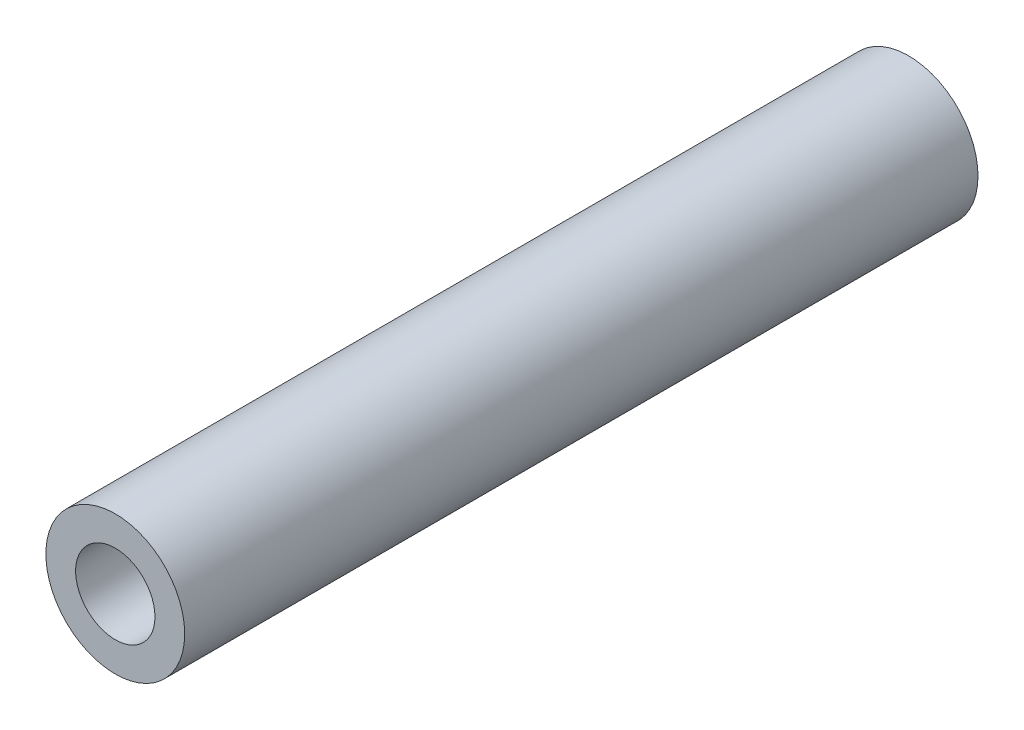
ISO-10303-21;
HEADER;
FILE_DESCRIPTION(('STEP AP214'),'2;1');
FILE_NAME('part.step','',(''),(''),'','','');
FILE_SCHEMA(('AUTOMOTIVE_DESIGN { 1 0 10303 214 1 1 1 1 }'));
ENDSEC;
DATA;
#1=APPLICATION_CONTEXT('core data for automotive mechanical design processes');
#2=APPLICATION_PROTOCOL_DEFINITION('international standard','automotive_design',2000,#1);
#3=PRODUCT_CONTEXT('',#1,'mechanical');
#4=PRODUCT('Part','Part','',(#3));
#5=PRODUCT_RELATED_PRODUCT_CATEGORY('part','',(#4));
#6=PRODUCT_DEFINITION_FORMATION('','',#4);
#7=PRODUCT_DEFINITION_CONTEXT('part definition',#1,'design');
#8=PRODUCT_DEFINITION('design','',#6,#7);
#9=PRODUCT_DEFINITION_SHAPE('','',#8);
#10=(LENGTH_UNIT() NAMED_UNIT(*) SI_UNIT(.MILLI.,.METRE.));
#11=(NAMED_UNIT(*) PLANE_ANGLE_UNIT() SI_UNIT($,.RADIAN.));
#12=(NAMED_UNIT(*) SI_UNIT($,.STERADIAN.) SOLID_ANGLE_UNIT());
#13=UNCERTAINTY_MEASURE_WITH_UNIT(LENGTH_MEASURE(1.E-05),#10,'distance_accuracy_value','');
#14=(GEOMETRIC_REPRESENTATION_CONTEXT(3) GLOBAL_UNCERTAINTY_ASSIGNED_CONTEXT((#13)) GLOBAL_UNIT_ASSIGNED_CONTEXT((#10,
#11,#12)) REPRESENTATION_CONTEXT('',''));
#15=CARTESIAN_POINT('',(0.,0.,0.));
#16=DIRECTION('',(0.,0.,1.));
#17=DIRECTION('',(1.,0.,0.));
#18=AXIS2_PLACEMENT_3D('',#15,#16,#17);
#19=CARTESIAN_POINT('',(0.,0.,40.));
#20=DIRECTION('',(0.,0.,1.));
#21=DIRECTION('',(1.,0.,0.));
#22=AXIS2_PLACEMENT_3D('',#19,#20,#21);
#23=PLANE('',#22);
#24=CARTESIAN_POINT('',(0.,0.,40.));
#25=DIRECTION('',(0.,0.,1.));
#26=DIRECTION('',(1.,0.,0.));
#27=AXIS2_PLACEMENT_3D('',#24,#25,#26);
#28=CIRCLE('',#27,3.5);
#29=CARTESIAN_POINT('',(3.5,0.,40.));
#30=VERTEX_POINT('',#29);
#31=EDGE_CURVE('E10',#30,#30,#28,.T.);
#32=ORIENTED_EDGE('',*,*,#31,.T.);
#33=EDGE_LOOP('',(#32));
#34=FACE_BOUND('',#33,.T.);
#35=CARTESIAN_POINT('',(0.,0.,40.));
#36=DIRECTION('',(0.,0.,1.));
#37=DIRECTION('',(1.,0.,0.));
#38=AXIS2_PLACEMENT_3D('',#35,#36,#37);
#39=CIRCLE('',#38,2.);
#40=CARTESIAN_POINT('',(2.,0.,40.));
#41=VERTEX_POINT('',#40);
#42=EDGE_CURVE('E56',#41,#41,#39,.T.);
#43=ORIENTED_EDGE('',*,*,#42,.F.);
#44=EDGE_LOOP('',(#43));
#45=FACE_BOUND('',#44,.T.);
#46=ADVANCED_FACE('F43',(#34,#45),#23,.T.);
#47=CARTESIAN_POINT('',(0.,0.,0.));
#48=DIRECTION('',(0.,0.,1.));
#49=DIRECTION('',(1.,0.,0.));
#50=AXIS2_PLACEMENT_3D('',#47,#48,#49);
#51=PLANE('',#50);
#52=CARTESIAN_POINT('',(0.,0.,0.));
#53=DIRECTION('',(0.,0.,1.));
#54=DIRECTION('',(1.,0.,0.));
#55=AXIS2_PLACEMENT_3D('',#52,#53,#54);
#56=CIRCLE('',#55,3.5);
#57=CARTESIAN_POINT('',(3.5,0.,0.));
#58=VERTEX_POINT('',#57);
#59=EDGE_CURVE('E47',#58,#58,#56,.T.);
#60=ORIENTED_EDGE('',*,*,#59,.F.);
#61=EDGE_LOOP('',(#60));
#62=FACE_BOUND('',#61,.T.);
#63=CARTESIAN_POINT('',(0.,0.,0.));
#64=DIRECTION('',(0.,0.,1.));
#65=DIRECTION('',(1.,0.,0.));
#66=AXIS2_PLACEMENT_3D('',#63,#64,#65);
#67=CIRCLE('',#66,2.);
#68=CARTESIAN_POINT('',(2.,0.,0.));
#69=VERTEX_POINT('',#68);
#70=EDGE_CURVE('E58',#69,#69,#67,.T.);
#71=ORIENTED_EDGE('',*,*,#70,.T.);
#72=EDGE_LOOP('',(#71));
#73=FACE_BOUND('',#72,.T.);
#74=ADVANCED_FACE('F70',(#62,#73),#51,.F.);
#75=CARTESIAN_POINT('',(0.,0.,40.));
#76=DIRECTION('',(0.,0.,-1.));
#77=DIRECTION('',(-1.,0.,0.));
#78=AXIS2_PLACEMENT_3D('',#75,#76,#77);
#79=CYLINDRICAL_SURFACE('',#78,3.5);
#80=ORIENTED_EDGE('',*,*,#31,.F.);
#81=EDGE_LOOP('',(#80));
#82=FACE_BOUND('',#81,.T.);
#83=ORIENTED_EDGE('',*,*,#59,.T.);
#84=EDGE_LOOP('',(#83));
#85=FACE_BOUND('',#84,.T.);
#86=ADVANCED_FACE('F45',(#82,#85),#79,.T.);
#87=CARTESIAN_POINT('',(0.,0.,40.));
#88=DIRECTION('',(0.,0.,-1.));
#89=DIRECTION('',(-1.,0.,0.));
#90=AXIS2_PLACEMENT_3D('',#87,#88,#89);
#91=CYLINDRICAL_SURFACE('',#90,2.);
#92=ORIENTED_EDGE('',*,*,#42,.T.);
#93=EDGE_LOOP('',(#92));
#94=FACE_BOUND('',#93,.T.);
#95=ORIENTED_EDGE('',*,*,#70,.F.);
#96=EDGE_LOOP('',(#95));
#97=FACE_BOUND('',#96,.T.);
#98=ADVANCED_FACE('F66',(#94,#97),#91,.F.);
#99=CLOSED_SHELL('',(#46,#74,#86,#98));
#100=MANIFOLD_SOLID_BREP('B2',#99);
#101=ADVANCED_BREP_SHAPE_REPRESENTATION('',(#18,#100),#14);
#102=SHAPE_DEFINITION_REPRESENTATION(#9,#101);
ENDSEC;
END-ISO-10303-21;
